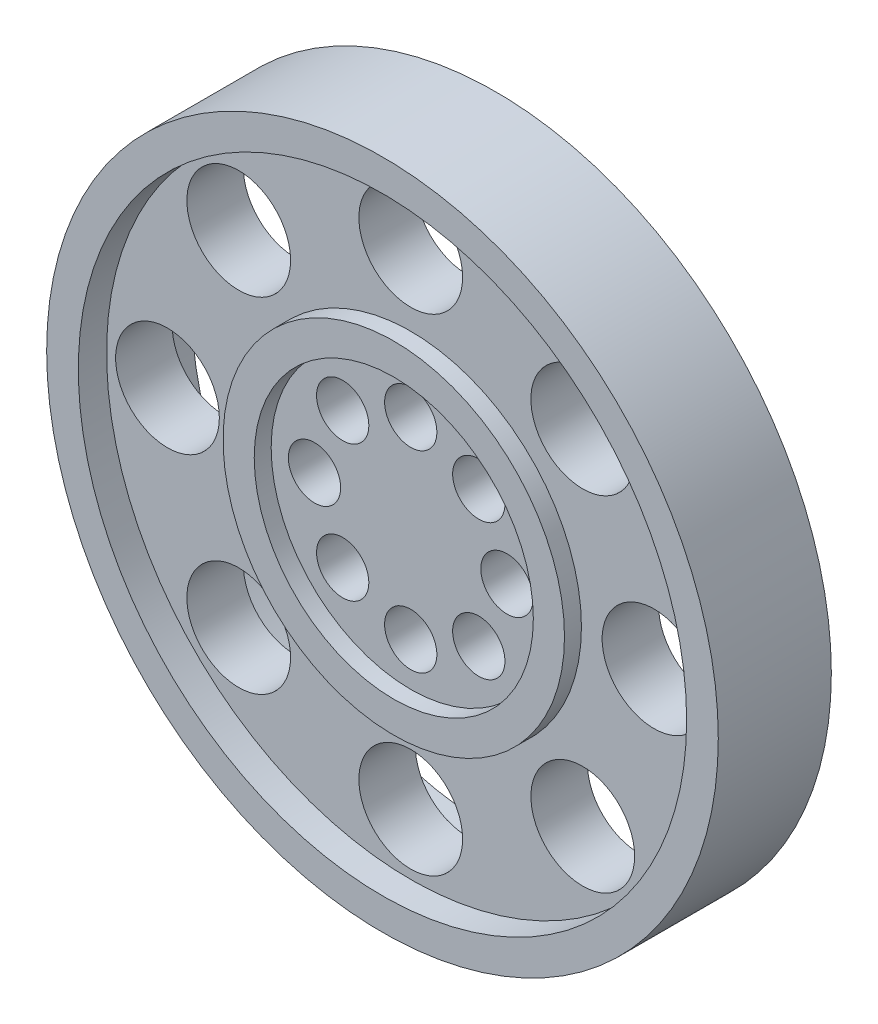
ISO-10303-21;
HEADER;
FILE_DESCRIPTION(('STEP AP214'),'2;1');
FILE_NAME('part.step','',(''),(''),'','','');
FILE_SCHEMA(('AUTOMOTIVE_DESIGN { 1 0 10303 214 1 1 1 1 }'));
ENDSEC;
DATA;
#1=APPLICATION_CONTEXT('core data for automotive mechanical design processes');
#2=APPLICATION_PROTOCOL_DEFINITION('international standard','automotive_design',2000,#1);
#3=PRODUCT_CONTEXT('',#1,'mechanical');
#4=PRODUCT('Part','Part','',(#3));
#5=PRODUCT_RELATED_PRODUCT_CATEGORY('part','',(#4));
#6=PRODUCT_DEFINITION_FORMATION('','',#4);
#7=PRODUCT_DEFINITION_CONTEXT('part definition',#1,'design');
#8=PRODUCT_DEFINITION('design','',#6,#7);
#9=PRODUCT_DEFINITION_SHAPE('','',#8);
#10=(LENGTH_UNIT() NAMED_UNIT(*) SI_UNIT(.MILLI.,.METRE.));
#11=(NAMED_UNIT(*) PLANE_ANGLE_UNIT() SI_UNIT($,.RADIAN.));
#12=(NAMED_UNIT(*) SI_UNIT($,.STERADIAN.) SOLID_ANGLE_UNIT());
#13=UNCERTAINTY_MEASURE_WITH_UNIT(LENGTH_MEASURE(1.E-05),#10,'distance_accuracy_value','');
#14=(GEOMETRIC_REPRESENTATION_CONTEXT(3) GLOBAL_UNCERTAINTY_ASSIGNED_CONTEXT((#13)) GLOBAL_UNIT_ASSIGNED_CONTEXT((#10,
#11,#12)) REPRESENTATION_CONTEXT('',''));
#15=CARTESIAN_POINT('',(0.,0.,0.));
#16=DIRECTION('',(0.,0.,1.));
#17=DIRECTION('',(1.,0.,0.));
#18=AXIS2_PLACEMENT_3D('',#15,#16,#17);
#19=CARTESIAN_POINT('',(0.,0.,8.));
#20=DIRECTION('',(0.,0.,-1.));
#21=DIRECTION('',(-1.,0.,0.));
#22=AXIS2_PLACEMENT_3D('',#19,#20,#21);
#23=CYLINDRICAL_SURFACE('',#22,24.69);
#24=CARTESIAN_POINT('',(0.,0.,-8.));
#25=DIRECTION('',(0.,0.,1.));
#26=DIRECTION('',(1.,0.,0.));
#27=AXIS2_PLACEMENT_3D('',#24,#25,#26);
#28=CIRCLE('',#27,24.69);
#29=CARTESIAN_POINT('',(24.69,0.,-8.));
#30=VERTEX_POINT('',#29);
#31=EDGE_CURVE('E129',#30,#30,#28,.T.);
#32=ORIENTED_EDGE('',*,*,#31,.F.);
#33=EDGE_LOOP('',(#32));
#34=FACE_BOUND('',#33,.T.);
#35=CARTESIAN_POINT('',(0.,0.,-5.));
#36=DIRECTION('',(0.,0.,1.));
#37=DIRECTION('',(1.,0.,0.));
#38=AXIS2_PLACEMENT_3D('',#35,#36,#37);
#39=CIRCLE('',#38,24.69);
#40=CARTESIAN_POINT('',(24.69,0.,-5.));
#41=VERTEX_POINT('',#40);
#42=EDGE_CURVE('E126',#41,#41,#39,.T.);
#43=ORIENTED_EDGE('',*,*,#42,.T.);
#44=EDGE_LOOP('',(#43));
#45=FACE_BOUND('',#44,.T.);
#46=ADVANCED_FACE('F39',(#34,#45),#23,.F.);
#47=CARTESIAN_POINT('',(0.,0.,10.));
#48=DIRECTION('',(0.,0.,-1.));
#49=DIRECTION('',(-1.,0.,0.));
#50=AXIS2_PLACEMENT_3D('',#47,#48,#49);
#51=CYLINDRICAL_SURFACE('',#50,53.81);
#52=CARTESIAN_POINT('',(0.,0.,-10.));
#53=DIRECTION('',(0.,0.,1.));
#54=DIRECTION('',(1.,0.,0.));
#55=AXIS2_PLACEMENT_3D('',#52,#53,#54);
#56=CIRCLE('',#55,53.81);
#57=CARTESIAN_POINT('',(53.81,0.,-10.));
#58=VERTEX_POINT('',#57);
#59=EDGE_CURVE('E152',#58,#58,#56,.T.);
#60=ORIENTED_EDGE('',*,*,#59,.F.);
#61=EDGE_LOOP('',(#60));
#62=FACE_BOUND('',#61,.T.);
#63=CARTESIAN_POINT('',(0.,0.,-5.));
#64=DIRECTION('',(0.,0.,1.));
#65=DIRECTION('',(1.,0.,0.));
#66=AXIS2_PLACEMENT_3D('',#63,#64,#65);
#67=CIRCLE('',#66,53.81);
#68=CARTESIAN_POINT('',(53.81,0.,-5.));
#69=VERTEX_POINT('',#68);
#70=EDGE_CURVE('E149',#69,#69,#67,.T.);
#71=ORIENTED_EDGE('',*,*,#70,.T.);
#72=EDGE_LOOP('',(#71));
#73=FACE_BOUND('',#72,.T.);
#74=ADVANCED_FACE('F185',(#62,#73),#51,.F.);
#75=CARTESIAN_POINT('',(0.,0.,5.));
#76=DIRECTION('',(0.,0.,1.));
#77=DIRECTION('',(1.,0.,0.));
#78=AXIS2_PLACEMENT_3D('',#75,#76,#77);
#79=CIRCLE('',#78,53.81);
#80=CARTESIAN_POINT('',(53.81,0.,5.));
#81=VERTEX_POINT('',#80);
#82=EDGE_CURVE('E47',#81,#81,#79,.T.);
#83=ORIENTED_EDGE('',*,*,#82,.F.);
#84=EDGE_LOOP('',(#83));
#85=FACE_BOUND('',#84,.T.);
#86=CARTESIAN_POINT('',(0.,0.,10.));
#87=DIRECTION('',(0.,0.,1.));
#88=DIRECTION('',(1.,0.,0.));
#89=AXIS2_PLACEMENT_3D('',#86,#87,#88);
#90=CIRCLE('',#89,53.81);
#91=CARTESIAN_POINT('',(53.81,0.,10.));
#92=VERTEX_POINT('',#91);
#93=EDGE_CURVE('E157',#92,#92,#90,.T.);
#94=ORIENTED_EDGE('',*,*,#93,.T.);
#95=EDGE_LOOP('',(#94));
#96=FACE_BOUND('',#95,.T.);
#97=ADVANCED_FACE('F41',(#85,#96),#51,.F.);
#98=CARTESIAN_POINT('',(0.,0.,10.));
#99=DIRECTION('',(0.,0.,-1.));
#100=DIRECTION('',(-1.,0.,0.));
#101=AXIS2_PLACEMENT_3D('',#98,#99,#100);
#102=CYLINDRICAL_SURFACE('',#101,59.41);
#103=CARTESIAN_POINT('',(0.,0.,10.));
#104=DIRECTION('',(0.,0.,1.));
#105=DIRECTION('',(1.,0.,0.));
#106=AXIS2_PLACEMENT_3D('',#103,#104,#105);
#107=CIRCLE('',#106,59.41);
#108=CARTESIAN_POINT('',(59.41,0.,10.));
#109=VERTEX_POINT('',#108);
#110=EDGE_CURVE('E52',#109,#109,#107,.T.);
#111=ORIENTED_EDGE('',*,*,#110,.F.);
#112=EDGE_LOOP('',(#111));
#113=FACE_BOUND('',#112,.T.);
#114=CARTESIAN_POINT('',(0.,0.,-10.));
#115=DIRECTION('',(0.,0.,1.));
#116=DIRECTION('',(1.,0.,0.));
#117=AXIS2_PLACEMENT_3D('',#114,#115,#116);
#118=CIRCLE('',#117,59.41);
#119=CARTESIAN_POINT('',(59.41,0.,-10.));
#120=VERTEX_POINT('',#119);
#121=EDGE_CURVE('E160',#120,#120,#118,.T.);
#122=ORIENTED_EDGE('',*,*,#121,.T.);
#123=EDGE_LOOP('',(#122));
#124=FACE_BOUND('',#123,.T.);
#125=ADVANCED_FACE('F167',(#113,#124),#102,.T.);
#126=CARTESIAN_POINT('',(0.,0.,10.));
#127=DIRECTION('',(0.,0.,1.));
#128=DIRECTION('',(1.,0.,0.));
#129=AXIS2_PLACEMENT_3D('',#126,#127,#128);
#130=PLANE('',#129);
#131=ORIENTED_EDGE('',*,*,#93,.F.);
#132=EDGE_LOOP('',(#131));
#133=FACE_BOUND('',#132,.T.);
#134=ORIENTED_EDGE('',*,*,#110,.T.);
#135=EDGE_LOOP('',(#134));
#136=FACE_BOUND('',#135,.T.);
#137=ADVANCED_FACE('F172',(#133,#136),#130,.T.);
#138=CARTESIAN_POINT('',(0.,0.,-10.));
#139=DIRECTION('',(0.,0.,1.));
#140=DIRECTION('',(1.,0.,0.));
#141=AXIS2_PLACEMENT_3D('',#138,#139,#140);
#142=PLANE('',#141);
#143=ORIENTED_EDGE('',*,*,#59,.T.);
#144=EDGE_LOOP('',(#143));
#145=FACE_BOUND('',#144,.T.);
#146=ORIENTED_EDGE('',*,*,#121,.F.);
#147=EDGE_LOOP('',(#146));
#148=FACE_BOUND('',#147,.T.);
#149=ADVANCED_FACE('F169',(#145,#148),#142,.F.);
#150=CARTESIAN_POINT('',(0.,43.035,5.));
#151=DIRECTION('',(0.,0.,-1.));
#152=DIRECTION('',(-1.,0.,0.));
#153=AXIS2_PLACEMENT_3D('',#150,#151,#152);
#154=CYLINDRICAL_SURFACE('',#153,9.175);
#155=CARTESIAN_POINT('',(0.,43.035,5.));
#156=DIRECTION('',(0.,0.,1.));
#157=DIRECTION('',(1.,0.,0.));
#158=AXIS2_PLACEMENT_3D('',#155,#156,#157);
#159=CIRCLE('',#158,9.175);
#160=CARTESIAN_POINT('',(9.175,43.035,5.));
#161=VERTEX_POINT('',#160);
#162=EDGE_CURVE('E145',#161,#161,#159,.T.);
#163=ORIENTED_EDGE('',*,*,#162,.T.);
#164=EDGE_LOOP('',(#163));
#165=FACE_BOUND('',#164,.T.);
#166=CARTESIAN_POINT('',(0.,43.035,-5.));
#167=DIRECTION('',(0.,0.,1.));
#168=DIRECTION('',(1.,0.,0.));
#169=AXIS2_PLACEMENT_3D('',#166,#167,#168);
#170=CIRCLE('',#169,9.175);
#171=CARTESIAN_POINT('',(9.175,43.035,-5.));
#172=VERTEX_POINT('',#171);
#173=EDGE_CURVE('E144',#172,#172,#170,.T.);
#174=ORIENTED_EDGE('',*,*,#173,.F.);
#175=EDGE_LOOP('',(#174));
#176=FACE_BOUND('',#175,.T.);
#177=ADVANCED_FACE('F171',(#165,#176),#154,.F.);
#178=CARTESIAN_POINT('',(0.,0.,5.));
#179=DIRECTION('',(0.,0.,1.));
#180=DIRECTION('',(1.,0.,0.));
#181=AXIS2_PLACEMENT_3D('',#178,#179,#180);
#182=PLANE('',#181);
#183=CARTESIAN_POINT('',(-30.4303403283629,-30.4303403283632,5.));
#184=DIRECTION('',(0.,0.,1.));
#185=DIRECTION('',(1.,0.,0.));
#186=AXIS2_PLACEMENT_3D('',#183,#184,#185);
#187=CIRCLE('',#186,9.175);
#188=CARTESIAN_POINT('',(-21.2553403283629,-30.4303403283632,5.));
#189=VERTEX_POINT('',#188);
#190=EDGE_CURVE('E60',#189,#189,#187,.T.);
#191=ORIENTED_EDGE('',*,*,#190,.F.);
#192=EDGE_LOOP('',(#191));
#193=FACE_BOUND('',#192,.T.);
#194=CARTESIAN_POINT('',(0.,-43.035,5.));
#195=DIRECTION('',(0.,0.,1.));
#196=DIRECTION('',(1.,0.,0.));
#197=AXIS2_PLACEMENT_3D('',#194,#195,#196);
#198=CIRCLE('',#197,9.175);
#199=CARTESIAN_POINT('',(9.175,-43.035,5.));
#200=VERTEX_POINT('',#199);
#201=EDGE_CURVE('E110',#200,#200,#198,.T.);
#202=ORIENTED_EDGE('',*,*,#201,.F.);
#203=EDGE_LOOP('',(#202));
#204=FACE_BOUND('',#203,.T.);
#205=CARTESIAN_POINT('',(-30.4303403283631,30.430340328363,5.));
#206=DIRECTION('',(0.,0.,1.));
#207=DIRECTION('',(1.,0.,0.));
#208=AXIS2_PLACEMENT_3D('',#205,#206,#207);
#209=CIRCLE('',#208,9.175);
#210=CARTESIAN_POINT('',(-21.2553403283631,30.430340328363,5.));
#211=VERTEX_POINT('',#210);
#212=EDGE_CURVE('E107',#211,#211,#209,.T.);
#213=ORIENTED_EDGE('',*,*,#212,.F.);
#214=EDGE_LOOP('',(#213));
#215=FACE_BOUND('',#214,.T.);
#216=CARTESIAN_POINT('',(-43.035,-1.49379452430569E-13,5.));
#217=DIRECTION('',(0.,0.,1.));
#218=DIRECTION('',(1.,0.,0.));
#219=AXIS2_PLACEMENT_3D('',#216,#217,#218);
#220=CIRCLE('',#219,9.175);
#221=CARTESIAN_POINT('',(-33.86,-1.49379452430569E-13,5.));
#222=VERTEX_POINT('',#221);
#223=EDGE_CURVE('E104',#222,#222,#220,.T.);
#224=ORIENTED_EDGE('',*,*,#223,.F.);
#225=EDGE_LOOP('',(#224));
#226=FACE_BOUND('',#225,.T.);
#227=CARTESIAN_POINT('',(43.035,4.49891251264798E-13,5.));
#228=DIRECTION('',(0.,0.,1.));
#229=DIRECTION('',(1.,0.,0.));
#230=AXIS2_PLACEMENT_3D('',#227,#228,#229);
#231=CIRCLE('',#230,9.175);
#232=CARTESIAN_POINT('',(52.21,4.49891251264798E-13,5.));
#233=VERTEX_POINT('',#232);
#234=EDGE_CURVE('E100',#233,#233,#231,.T.);
#235=ORIENTED_EDGE('',*,*,#234,.F.);
#236=EDGE_LOOP('',(#235));
#237=FACE_BOUND('',#236,.T.);
#238=CARTESIAN_POINT('',(30.4303403283633,-30.4303403283628,5.));
#239=DIRECTION('',(0.,0.,1.));
#240=DIRECTION('',(1.,0.,0.));
#241=AXIS2_PLACEMENT_3D('',#238,#239,#240);
#242=CIRCLE('',#241,9.175);
#243=CARTESIAN_POINT('',(39.6053403283633,-30.4303403283628,5.));
#244=VERTEX_POINT('',#243);
#245=EDGE_CURVE('E96',#244,#244,#242,.T.);
#246=ORIENTED_EDGE('',*,*,#245,.F.);
#247=EDGE_LOOP('',(#246));
#248=FACE_BOUND('',#247,.T.);
#249=CARTESIAN_POINT('',(30.4303403283627,30.4303403283634,5.));
#250=DIRECTION('',(0.,0.,1.));
#251=DIRECTION('',(1.,0.,0.));
#252=AXIS2_PLACEMENT_3D('',#249,#250,#251);
#253=CIRCLE('',#252,9.175);
#254=CARTESIAN_POINT('',(39.6053403283627,30.4303403283634,5.));
#255=VERTEX_POINT('',#254);
#256=EDGE_CURVE('E92',#255,#255,#253,.T.);
#257=ORIENTED_EDGE('',*,*,#256,.F.);
#258=EDGE_LOOP('',(#257));
#259=FACE_BOUND('',#258,.T.);
#260=ORIENTED_EDGE('',*,*,#162,.F.);
#261=EDGE_LOOP('',(#260));
#262=FACE_BOUND('',#261,.T.);
#263=CARTESIAN_POINT('',(0.,0.,5.));
#264=DIRECTION('',(0.,0.,1.));
#265=DIRECTION('',(1.,0.,0.));
#266=AXIS2_PLACEMENT_3D('',#263,#264,#265);
#267=CIRCLE('',#266,30.2);
#268=CARTESIAN_POINT('',(30.2,0.,5.));
#269=VERTEX_POINT('',#268);
#270=EDGE_CURVE('E148',#269,#269,#267,.T.);
#271=ORIENTED_EDGE('',*,*,#270,.F.);
#272=EDGE_LOOP('',(#271));
#273=FACE_BOUND('',#272,.T.);
#274=ORIENTED_EDGE('',*,*,#82,.T.);
#275=EDGE_LOOP('',(#274));
#276=FACE_BOUND('',#275,.T.);
#277=ADVANCED_FACE('F179',(#193,#204,#215,#226,#237,#248,#259,#262,#273,#276),#182,.T.);
#278=CARTESIAN_POINT('',(0.,0.,-5.));
#279=DIRECTION('',(0.,0.,1.));
#280=DIRECTION('',(1.,0.,0.));
#281=AXIS2_PLACEMENT_3D('',#278,#279,#280);
#282=PLANE('',#281);
#283=CARTESIAN_POINT('',(-30.4303403283629,-30.4303403283632,-5.));
#284=DIRECTION('',(0.,0.,1.));
#285=DIRECTION('',(1.,0.,0.));
#286=AXIS2_PLACEMENT_3D('',#283,#284,#285);
#287=CIRCLE('',#286,9.175);
#288=CARTESIAN_POINT('',(-21.2553403283629,-30.4303403283632,-5.));
#289=VERTEX_POINT('',#288);
#290=EDGE_CURVE('E43',#289,#289,#287,.T.);
#291=ORIENTED_EDGE('',*,*,#290,.T.);
#292=EDGE_LOOP('',(#291));
#293=FACE_BOUND('',#292,.T.);
#294=CARTESIAN_POINT('',(0.,-43.035,-5.));
#295=DIRECTION('',(0.,0.,1.));
#296=DIRECTION('',(1.,0.,0.));
#297=AXIS2_PLACEMENT_3D('',#294,#295,#296);
#298=CIRCLE('',#297,9.175);
#299=CARTESIAN_POINT('',(9.175,-43.035,-5.));
#300=VERTEX_POINT('',#299);
#301=EDGE_CURVE('E108',#300,#300,#298,.T.);
#302=ORIENTED_EDGE('',*,*,#301,.T.);
#303=EDGE_LOOP('',(#302));
#304=FACE_BOUND('',#303,.T.);
#305=CARTESIAN_POINT('',(-30.4303403283631,30.430340328363,-5.));
#306=DIRECTION('',(0.,0.,1.));
#307=DIRECTION('',(1.,0.,0.));
#308=AXIS2_PLACEMENT_3D('',#305,#306,#307);
#309=CIRCLE('',#308,9.175);
#310=CARTESIAN_POINT('',(-21.2553403283631,30.430340328363,-5.));
#311=VERTEX_POINT('',#310);
#312=EDGE_CURVE('E105',#311,#311,#309,.T.);
#313=ORIENTED_EDGE('',*,*,#312,.T.);
#314=EDGE_LOOP('',(#313));
#315=FACE_BOUND('',#314,.T.);
#316=CARTESIAN_POINT('',(-43.035,-1.49379452430569E-13,-5.));
#317=DIRECTION('',(0.,0.,1.));
#318=DIRECTION('',(1.,0.,0.));
#319=AXIS2_PLACEMENT_3D('',#316,#317,#318);
#320=CIRCLE('',#319,9.175);
#321=CARTESIAN_POINT('',(-33.86,-1.49379452430569E-13,-5.));
#322=VERTEX_POINT('',#321);
#323=EDGE_CURVE('E101',#322,#322,#320,.T.);
#324=ORIENTED_EDGE('',*,*,#323,.T.);
#325=EDGE_LOOP('',(#324));
#326=FACE_BOUND('',#325,.T.);
#327=CARTESIAN_POINT('',(43.035,4.49891251264798E-13,-5.));
#328=DIRECTION('',(0.,0.,1.));
#329=DIRECTION('',(1.,0.,0.));
#330=AXIS2_PLACEMENT_3D('',#327,#328,#329);
#331=CIRCLE('',#330,9.175);
#332=CARTESIAN_POINT('',(52.21,4.49891251264798E-13,-5.));
#333=VERTEX_POINT('',#332);
#334=EDGE_CURVE('E97',#333,#333,#331,.T.);
#335=ORIENTED_EDGE('',*,*,#334,.T.);
#336=EDGE_LOOP('',(#335));
#337=FACE_BOUND('',#336,.T.);
#338=CARTESIAN_POINT('',(30.4303403283633,-30.4303403283628,-5.));
#339=DIRECTION('',(0.,0.,1.));
#340=DIRECTION('',(1.,0.,0.));
#341=AXIS2_PLACEMENT_3D('',#338,#339,#340);
#342=CIRCLE('',#341,9.175);
#343=CARTESIAN_POINT('',(39.6053403283633,-30.4303403283628,-5.));
#344=VERTEX_POINT('',#343);
#345=EDGE_CURVE('E93',#344,#344,#342,.T.);
#346=ORIENTED_EDGE('',*,*,#345,.T.);
#347=EDGE_LOOP('',(#346));
#348=FACE_BOUND('',#347,.T.);
#349=CARTESIAN_POINT('',(30.4303403283627,30.4303403283634,-5.));
#350=DIRECTION('',(0.,0.,1.));
#351=DIRECTION('',(1.,0.,0.));
#352=AXIS2_PLACEMENT_3D('',#349,#350,#351);
#353=CIRCLE('',#352,9.175);
#354=CARTESIAN_POINT('',(39.6053403283627,30.4303403283634,-5.));
#355=VERTEX_POINT('',#354);
#356=EDGE_CURVE('E89',#355,#355,#353,.T.);
#357=ORIENTED_EDGE('',*,*,#356,.T.);
#358=EDGE_LOOP('',(#357));
#359=FACE_BOUND('',#358,.T.);
#360=ORIENTED_EDGE('',*,*,#173,.T.);
#361=EDGE_LOOP('',(#360));
#362=FACE_BOUND('',#361,.T.);
#363=CARTESIAN_POINT('',(0.,0.,-5.));
#364=DIRECTION('',(0.,0.,1.));
#365=DIRECTION('',(1.,0.,0.));
#366=AXIS2_PLACEMENT_3D('',#363,#364,#365);
#367=CIRCLE('',#366,30.2);
#368=CARTESIAN_POINT('',(30.2,0.,-5.));
#369=VERTEX_POINT('',#368);
#370=EDGE_CURVE('E137',#369,#369,#367,.F.);
#371=ORIENTED_EDGE('',*,*,#370,.F.);
#372=EDGE_LOOP('',(#371));
#373=FACE_BOUND('',#372,.T.);
#374=ORIENTED_EDGE('',*,*,#70,.F.);
#375=EDGE_LOOP('',(#374));
#376=FACE_BOUND('',#375,.T.);
#377=ADVANCED_FACE('F207',(#293,#304,#315,#326,#337,#348,#359,#362,#373,#376),#282,.F.);
#378=CARTESIAN_POINT('',(0.,0.,8.));
#379=DIRECTION('',(0.,0.,-1.));
#380=DIRECTION('',(-1.,0.,0.));
#381=AXIS2_PLACEMENT_3D('',#378,#379,#380);
#382=CYLINDRICAL_SURFACE('',#381,30.2);
#383=CARTESIAN_POINT('',(0.,0.,-8.));
#384=DIRECTION('',(0.,0.,1.));
#385=DIRECTION('',(1.,0.,0.));
#386=AXIS2_PLACEMENT_3D('',#383,#384,#385);
#387=CIRCLE('',#386,30.2);
#388=CARTESIAN_POINT('',(30.2,0.,-8.));
#389=VERTEX_POINT('',#388);
#390=EDGE_CURVE('E134',#389,#389,#387,.T.);
#391=ORIENTED_EDGE('',*,*,#390,.T.);
#392=EDGE_LOOP('',(#391));
#393=FACE_BOUND('',#392,.T.);
#394=ORIENTED_EDGE('',*,*,#370,.T.);
#395=EDGE_LOOP('',(#394));
#396=FACE_BOUND('',#395,.T.);
#397=ADVANCED_FACE('F199',(#393,#396),#382,.T.);
#398=CARTESIAN_POINT('',(0.,0.,5.));
#399=DIRECTION('',(0.,0.,1.));
#400=DIRECTION('',(1.,0.,0.));
#401=AXIS2_PLACEMENT_3D('',#398,#399,#400);
#402=CIRCLE('',#401,24.69);
#403=CARTESIAN_POINT('',(24.69,0.,5.));
#404=VERTEX_POINT('',#403);
#405=EDGE_CURVE('E11',#404,#404,#402,.T.);
#406=ORIENTED_EDGE('',*,*,#405,.F.);
#407=EDGE_LOOP('',(#406));
#408=FACE_BOUND('',#407,.T.);
#409=CARTESIAN_POINT('',(0.,0.,8.));
#410=DIRECTION('',(0.,0.,1.));
#411=DIRECTION('',(1.,0.,0.));
#412=AXIS2_PLACEMENT_3D('',#409,#410,#411);
#413=CIRCLE('',#412,24.69);
#414=CARTESIAN_POINT('',(24.69,0.,8.));
#415=VERTEX_POINT('',#414);
#416=EDGE_CURVE('E130',#415,#415,#413,.T.);
#417=ORIENTED_EDGE('',*,*,#416,.T.);
#418=EDGE_LOOP('',(#417));
#419=FACE_BOUND('',#418,.T.);
#420=ADVANCED_FACE('F188',(#408,#419),#23,.F.);
#421=ORIENTED_EDGE('',*,*,#270,.T.);
#422=EDGE_LOOP('',(#421));
#423=FACE_BOUND('',#422,.T.);
#424=CARTESIAN_POINT('',(0.,0.,8.));
#425=DIRECTION('',(0.,0.,1.));
#426=DIRECTION('',(1.,0.,0.));
#427=AXIS2_PLACEMENT_3D('',#424,#425,#426);
#428=CIRCLE('',#427,30.2);
#429=CARTESIAN_POINT('',(30.2,0.,8.));
#430=VERTEX_POINT('',#429);
#431=EDGE_CURVE('E133',#430,#430,#428,.T.);
#432=ORIENTED_EDGE('',*,*,#431,.F.);
#433=EDGE_LOOP('',(#432));
#434=FACE_BOUND('',#433,.T.);
#435=ADVANCED_FACE('F198',(#423,#434),#382,.T.);
#436=CARTESIAN_POINT('',(0.,0.,8.));
#437=DIRECTION('',(0.,0.,1.));
#438=DIRECTION('',(1.,0.,0.));
#439=AXIS2_PLACEMENT_3D('',#436,#437,#438);
#440=PLANE('',#439);
#441=ORIENTED_EDGE('',*,*,#416,.F.);
#442=EDGE_LOOP('',(#441));
#443=FACE_BOUND('',#442,.T.);
#444=ORIENTED_EDGE('',*,*,#431,.T.);
#445=EDGE_LOOP('',(#444));
#446=FACE_BOUND('',#445,.T.);
#447=ADVANCED_FACE('F205',(#443,#446),#440,.T.);
#448=CARTESIAN_POINT('',(0.,0.,-8.));
#449=DIRECTION('',(0.,0.,1.));
#450=DIRECTION('',(1.,0.,0.));
#451=AXIS2_PLACEMENT_3D('',#448,#449,#450);
#452=PLANE('',#451);
#453=ORIENTED_EDGE('',*,*,#31,.T.);
#454=EDGE_LOOP('',(#453));
#455=FACE_BOUND('',#454,.T.);
#456=ORIENTED_EDGE('',*,*,#390,.F.);
#457=EDGE_LOOP('',(#456));
#458=FACE_BOUND('',#457,.T.);
#459=ADVANCED_FACE('F214',(#455,#458),#452,.F.);
#460=CARTESIAN_POINT('',(0.,0.,-5.));
#461=DIRECTION('',(0.,0.,1.));
#462=DIRECTION('',(1.,0.,0.));
#463=AXIS2_PLACEMENT_3D('',#460,#461,#462);
#464=PLANE('',#463);
#465=CARTESIAN_POINT('',(0.,-17.0240575008076,-5.));
#466=DIRECTION('',(0.,0.,1.));
#467=DIRECTION('',(1.,0.,0.));
#468=AXIS2_PLACEMENT_3D('',#465,#466,#467);
#469=CIRCLE('',#468,4.625);
#470=CARTESIAN_POINT('',(4.625,-17.0240575008076,-5.));
#471=VERTEX_POINT('',#470);
#472=EDGE_CURVE('E88',#471,#471,#469,.T.);
#473=ORIENTED_EDGE('',*,*,#472,.T.);
#474=EDGE_LOOP('',(#473));
#475=FACE_BOUND('',#474,.T.);
#476=CARTESIAN_POINT('',(12.0378265021308,-12.0378265021306,-5.));
#477=DIRECTION('',(0.,0.,1.));
#478=DIRECTION('',(1.,0.,0.));
#479=AXIS2_PLACEMENT_3D('',#476,#477,#478);
#480=CIRCLE('',#479,4.625);
#481=CARTESIAN_POINT('',(16.6628265021308,-12.0378265021306,-5.));
#482=VERTEX_POINT('',#481);
#483=EDGE_CURVE('E84',#482,#482,#480,.T.);
#484=ORIENTED_EDGE('',*,*,#483,.T.);
#485=EDGE_LOOP('',(#484));
#486=FACE_BOUND('',#485,.T.);
#487=CARTESIAN_POINT('',(-17.0240575008076,0.,-5.));
#488=DIRECTION('',(0.,0.,1.));
#489=DIRECTION('',(1.,0.,0.));
#490=AXIS2_PLACEMENT_3D('',#487,#488,#489);
#491=CIRCLE('',#490,4.625);
#492=CARTESIAN_POINT('',(-12.3990575008076,0.,-5.));
#493=VERTEX_POINT('',#492);
#494=EDGE_CURVE('E80',#493,#493,#491,.T.);
#495=ORIENTED_EDGE('',*,*,#494,.T.);
#496=EDGE_LOOP('',(#495));
#497=FACE_BOUND('',#496,.T.);
#498=CARTESIAN_POINT('',(-12.0378265021307,-12.0378265021308,-5.));
#499=DIRECTION('',(0.,0.,1.));
#500=DIRECTION('',(1.,0.,0.));
#501=AXIS2_PLACEMENT_3D('',#498,#499,#500);
#502=CIRCLE('',#501,4.625);
#503=CARTESIAN_POINT('',(-7.41282650213068,-12.0378265021308,-5.));
#504=VERTEX_POINT('',#503);
#505=EDGE_CURVE('E76',#504,#504,#502,.T.);
#506=ORIENTED_EDGE('',*,*,#505,.T.);
#507=EDGE_LOOP('',(#506));
#508=FACE_BOUND('',#507,.T.);
#509=CARTESIAN_POINT('',(12.0378265021306,12.0378265021309,-5.));
#510=DIRECTION('',(0.,0.,1.));
#511=DIRECTION('',(1.,0.,0.));
#512=AXIS2_PLACEMENT_3D('',#509,#510,#511);
#513=CIRCLE('',#512,4.625);
#514=CARTESIAN_POINT('',(16.6628265021306,12.0378265021309,-5.));
#515=VERTEX_POINT('',#514);
#516=EDGE_CURVE('E72',#515,#515,#513,.T.);
#517=ORIENTED_EDGE('',*,*,#516,.T.);
#518=EDGE_LOOP('',(#517));
#519=FACE_BOUND('',#518,.T.);
#520=CARTESIAN_POINT('',(17.0240575008076,1.78317537226386E-13,-5.));
#521=DIRECTION('',(0.,0.,1.));
#522=DIRECTION('',(1.,0.,0.));
#523=AXIS2_PLACEMENT_3D('',#520,#521,#522);
#524=CIRCLE('',#523,4.625);
#525=CARTESIAN_POINT('',(21.6490575008076,1.78317537226386E-13,-5.));
#526=VERTEX_POINT('',#525);
#527=EDGE_CURVE('E68',#526,#526,#524,.T.);
#528=ORIENTED_EDGE('',*,*,#527,.T.);
#529=EDGE_LOOP('',(#528));
#530=FACE_BOUND('',#529,.T.);
#531=CARTESIAN_POINT('',(-12.0378265021308,12.0378265021307,-5.));
#532=DIRECTION('',(0.,0.,1.));
#533=DIRECTION('',(1.,0.,0.));
#534=AXIS2_PLACEMENT_3D('',#531,#532,#533);
#535=CIRCLE('',#534,4.625);
#536=CARTESIAN_POINT('',(-7.41282650213077,12.0378265021307,-5.));
#537=VERTEX_POINT('',#536);
#538=EDGE_CURVE('E64',#537,#537,#535,.T.);
#539=ORIENTED_EDGE('',*,*,#538,.T.);
#540=EDGE_LOOP('',(#539));
#541=FACE_BOUND('',#540,.T.);
#542=CARTESIAN_POINT('',(0.,17.0240575008076,-5.));
#543=DIRECTION('',(0.,0.,1.));
#544=DIRECTION('',(1.,0.,0.));
#545=AXIS2_PLACEMENT_3D('',#542,#543,#544);
#546=CIRCLE('',#545,4.625);
#547=CARTESIAN_POINT('',(4.625,17.0240575008076,-5.));
#548=VERTEX_POINT('',#547);
#549=EDGE_CURVE('E59',#548,#548,#546,.T.);
#550=ORIENTED_EDGE('',*,*,#549,.T.);
#551=EDGE_LOOP('',(#550));
#552=FACE_BOUND('',#551,.T.);
#553=ORIENTED_EDGE('',*,*,#42,.F.);
#554=EDGE_LOOP('',(#553));
#555=FACE_BOUND('',#554,.T.);
#556=ADVANCED_FACE('F221',(#475,#486,#497,#508,#519,#530,#541,#552,#555),#464,.F.);
#557=CARTESIAN_POINT('',(0.,0.,5.));
#558=DIRECTION('',(0.,0.,1.));
#559=DIRECTION('',(1.,0.,0.));
#560=AXIS2_PLACEMENT_3D('',#557,#558,#559);
#561=PLANE('',#560);
#562=CARTESIAN_POINT('',(0.,-17.0240575008076,5.));
#563=DIRECTION('',(0.,0.,1.));
#564=DIRECTION('',(1.,0.,0.));
#565=AXIS2_PLACEMENT_3D('',#562,#563,#564);
#566=CIRCLE('',#565,4.625);
#567=CARTESIAN_POINT('',(4.625,-17.0240575008076,5.));
#568=VERTEX_POINT('',#567);
#569=EDGE_CURVE('E85',#568,#568,#566,.T.);
#570=ORIENTED_EDGE('',*,*,#569,.F.);
#571=EDGE_LOOP('',(#570));
#572=FACE_BOUND('',#571,.T.);
#573=CARTESIAN_POINT('',(12.0378265021308,-12.0378265021306,5.));
#574=DIRECTION('',(0.,0.,1.));
#575=DIRECTION('',(1.,0.,0.));
#576=AXIS2_PLACEMENT_3D('',#573,#574,#575);
#577=CIRCLE('',#576,4.625);
#578=CARTESIAN_POINT('',(16.6628265021308,-12.0378265021306,5.));
#579=VERTEX_POINT('',#578);
#580=EDGE_CURVE('E81',#579,#579,#577,.T.);
#581=ORIENTED_EDGE('',*,*,#580,.F.);
#582=EDGE_LOOP('',(#581));
#583=FACE_BOUND('',#582,.T.);
#584=CARTESIAN_POINT('',(-17.0240575008076,0.,5.));
#585=DIRECTION('',(0.,0.,1.));
#586=DIRECTION('',(1.,0.,0.));
#587=AXIS2_PLACEMENT_3D('',#584,#585,#586);
#588=CIRCLE('',#587,4.625);
#589=CARTESIAN_POINT('',(-12.3990575008076,0.,5.));
#590=VERTEX_POINT('',#589);
#591=EDGE_CURVE('E77',#590,#590,#588,.T.);
#592=ORIENTED_EDGE('',*,*,#591,.F.);
#593=EDGE_LOOP('',(#592));
#594=FACE_BOUND('',#593,.T.);
#595=CARTESIAN_POINT('',(-12.0378265021307,-12.0378265021308,5.));
#596=DIRECTION('',(0.,0.,1.));
#597=DIRECTION('',(1.,0.,0.));
#598=AXIS2_PLACEMENT_3D('',#595,#596,#597);
#599=CIRCLE('',#598,4.625);
#600=CARTESIAN_POINT('',(-7.41282650213068,-12.0378265021308,5.));
#601=VERTEX_POINT('',#600);
#602=EDGE_CURVE('E73',#601,#601,#599,.T.);
#603=ORIENTED_EDGE('',*,*,#602,.F.);
#604=EDGE_LOOP('',(#603));
#605=FACE_BOUND('',#604,.T.);
#606=CARTESIAN_POINT('',(12.0378265021306,12.0378265021309,5.));
#607=DIRECTION('',(0.,0.,1.));
#608=DIRECTION('',(1.,0.,0.));
#609=AXIS2_PLACEMENT_3D('',#606,#607,#608);
#610=CIRCLE('',#609,4.625);
#611=CARTESIAN_POINT('',(16.6628265021306,12.0378265021309,5.));
#612=VERTEX_POINT('',#611);
#613=EDGE_CURVE('E69',#612,#612,#610,.T.);
#614=ORIENTED_EDGE('',*,*,#613,.F.);
#615=EDGE_LOOP('',(#614));
#616=FACE_BOUND('',#615,.T.);
#617=CARTESIAN_POINT('',(17.0240575008076,1.78317537226386E-13,5.));
#618=DIRECTION('',(0.,0.,1.));
#619=DIRECTION('',(1.,0.,0.));
#620=AXIS2_PLACEMENT_3D('',#617,#618,#619);
#621=CIRCLE('',#620,4.625);
#622=CARTESIAN_POINT('',(21.6490575008076,1.78317537226386E-13,5.));
#623=VERTEX_POINT('',#622);
#624=EDGE_CURVE('E65',#623,#623,#621,.T.);
#625=ORIENTED_EDGE('',*,*,#624,.F.);
#626=EDGE_LOOP('',(#625));
#627=FACE_BOUND('',#626,.T.);
#628=CARTESIAN_POINT('',(-12.0378265021308,12.0378265021307,5.));
#629=DIRECTION('',(0.,0.,1.));
#630=DIRECTION('',(1.,0.,0.));
#631=AXIS2_PLACEMENT_3D('',#628,#629,#630);
#632=CIRCLE('',#631,4.625);
#633=CARTESIAN_POINT('',(-7.41282650213077,12.0378265021307,5.));
#634=VERTEX_POINT('',#633);
#635=EDGE_CURVE('E61',#634,#634,#632,.T.);
#636=ORIENTED_EDGE('',*,*,#635,.F.);
#637=EDGE_LOOP('',(#636));
#638=FACE_BOUND('',#637,.T.);
#639=CARTESIAN_POINT('',(0.,17.0240575008076,5.));
#640=DIRECTION('',(0.,0.,1.));
#641=DIRECTION('',(1.,0.,0.));
#642=AXIS2_PLACEMENT_3D('',#639,#640,#641);
#643=CIRCLE('',#642,4.625);
#644=CARTESIAN_POINT('',(4.625,17.0240575008076,5.));
#645=VERTEX_POINT('',#644);
#646=EDGE_CURVE('E56',#645,#645,#643,.T.);
#647=ORIENTED_EDGE('',*,*,#646,.F.);
#648=EDGE_LOOP('',(#647));
#649=FACE_BOUND('',#648,.T.);
#650=ORIENTED_EDGE('',*,*,#405,.T.);
#651=EDGE_LOOP('',(#650));
#652=FACE_BOUND('',#651,.T.);
#653=ADVANCED_FACE('F225',(#572,#583,#594,#605,#616,#627,#638,#649,#652),#561,.T.);
#654=CARTESIAN_POINT('',(0.,17.0240575008076,-10.));
#655=DIRECTION('',(0.,0.,1.));
#656=DIRECTION('',(1.,0.,0.));
#657=AXIS2_PLACEMENT_3D('',#654,#655,#656);
#658=CYLINDRICAL_SURFACE('',#657,4.625);
#659=ORIENTED_EDGE('',*,*,#646,.T.);
#660=EDGE_LOOP('',(#659));
#661=FACE_BOUND('',#660,.T.);
#662=ORIENTED_EDGE('',*,*,#549,.F.);
#663=EDGE_LOOP('',(#662));
#664=FACE_BOUND('',#663,.T.);
#665=ADVANCED_FACE('F228',(#661,#664),#658,.F.);
#666=CARTESIAN_POINT('',(-12.0378265021308,12.0378265021307,-10.));
#667=DIRECTION('',(0.,0.,1.));
#668=DIRECTION('',(1.,0.,0.));
#669=AXIS2_PLACEMENT_3D('',#666,#667,#668);
#670=CYLINDRICAL_SURFACE('',#669,4.625);
#671=ORIENTED_EDGE('',*,*,#635,.T.);
#672=EDGE_LOOP('',(#671));
#673=FACE_BOUND('',#672,.T.);
#674=ORIENTED_EDGE('',*,*,#538,.F.);
#675=EDGE_LOOP('',(#674));
#676=FACE_BOUND('',#675,.T.);
#677=ADVANCED_FACE('F235',(#673,#676),#670,.F.);
#678=CARTESIAN_POINT('',(17.0240575008076,1.78317537226386E-13,-10.));
#679=DIRECTION('',(0.,0.,1.));
#680=DIRECTION('',(1.,0.,0.));
#681=AXIS2_PLACEMENT_3D('',#678,#679,#680);
#682=CYLINDRICAL_SURFACE('',#681,4.625);
#683=ORIENTED_EDGE('',*,*,#624,.T.);
#684=EDGE_LOOP('',(#683));
#685=FACE_BOUND('',#684,.T.);
#686=ORIENTED_EDGE('',*,*,#527,.F.);
#687=EDGE_LOOP('',(#686));
#688=FACE_BOUND('',#687,.T.);
#689=ADVANCED_FACE('F239',(#685,#688),#682,.F.);
#690=CARTESIAN_POINT('',(12.0378265021306,12.0378265021309,-10.));
#691=DIRECTION('',(0.,0.,1.));
#692=DIRECTION('',(1.,0.,0.));
#693=AXIS2_PLACEMENT_3D('',#690,#691,#692);
#694=CYLINDRICAL_SURFACE('',#693,4.625);
#695=ORIENTED_EDGE('',*,*,#613,.T.);
#696=EDGE_LOOP('',(#695));
#697=FACE_BOUND('',#696,.T.);
#698=ORIENTED_EDGE('',*,*,#516,.F.);
#699=EDGE_LOOP('',(#698));
#700=FACE_BOUND('',#699,.T.);
#701=ADVANCED_FACE('F254',(#697,#700),#694,.F.);
#702=CARTESIAN_POINT('',(-12.0378265021307,-12.0378265021308,-10.));
#703=DIRECTION('',(0.,0.,1.));
#704=DIRECTION('',(1.,0.,0.));
#705=AXIS2_PLACEMENT_3D('',#702,#703,#704);
#706=CYLINDRICAL_SURFACE('',#705,4.625);
#707=ORIENTED_EDGE('',*,*,#602,.T.);
#708=EDGE_LOOP('',(#707));
#709=FACE_BOUND('',#708,.T.);
#710=ORIENTED_EDGE('',*,*,#505,.F.);
#711=EDGE_LOOP('',(#710));
#712=FACE_BOUND('',#711,.T.);
#713=ADVANCED_FACE('F245',(#709,#712),#706,.F.);
#714=CARTESIAN_POINT('',(-17.0240575008076,0.,-10.));
#715=DIRECTION('',(0.,0.,1.));
#716=DIRECTION('',(1.,0.,0.));
#717=AXIS2_PLACEMENT_3D('',#714,#715,#716);
#718=CYLINDRICAL_SURFACE('',#717,4.625);
#719=ORIENTED_EDGE('',*,*,#591,.T.);
#720=EDGE_LOOP('',(#719));
#721=FACE_BOUND('',#720,.T.);
#722=ORIENTED_EDGE('',*,*,#494,.F.);
#723=EDGE_LOOP('',(#722));
#724=FACE_BOUND('',#723,.T.);
#725=ADVANCED_FACE('F241',(#721,#724),#718,.F.);
#726=CARTESIAN_POINT('',(12.0378265021308,-12.0378265021306,-10.));
#727=DIRECTION('',(0.,0.,1.));
#728=DIRECTION('',(1.,0.,0.));
#729=AXIS2_PLACEMENT_3D('',#726,#727,#728);
#730=CYLINDRICAL_SURFACE('',#729,4.625);
#731=ORIENTED_EDGE('',*,*,#580,.T.);
#732=EDGE_LOOP('',(#731));
#733=FACE_BOUND('',#732,.T.);
#734=ORIENTED_EDGE('',*,*,#483,.F.);
#735=EDGE_LOOP('',(#734));
#736=FACE_BOUND('',#735,.T.);
#737=ADVANCED_FACE('F244',(#733,#736),#730,.F.);
#738=CARTESIAN_POINT('',(0.,-17.0240575008076,-10.));
#739=DIRECTION('',(0.,0.,1.));
#740=DIRECTION('',(1.,0.,0.));
#741=AXIS2_PLACEMENT_3D('',#738,#739,#740);
#742=CYLINDRICAL_SURFACE('',#741,4.625);
#743=ORIENTED_EDGE('',*,*,#569,.T.);
#744=EDGE_LOOP('',(#743));
#745=FACE_BOUND('',#744,.T.);
#746=ORIENTED_EDGE('',*,*,#472,.F.);
#747=EDGE_LOOP('',(#746));
#748=FACE_BOUND('',#747,.T.);
#749=ADVANCED_FACE('F260',(#745,#748),#742,.F.);
#750=CARTESIAN_POINT('',(30.4303403283627,30.4303403283634,-10.));
#751=DIRECTION('',(0.,0.,1.));
#752=DIRECTION('',(1.,0.,0.));
#753=AXIS2_PLACEMENT_3D('',#750,#751,#752);
#754=CYLINDRICAL_SURFACE('',#753,9.175);
#755=ORIENTED_EDGE('',*,*,#256,.T.);
#756=EDGE_LOOP('',(#755));
#757=FACE_BOUND('',#756,.T.);
#758=ORIENTED_EDGE('',*,*,#356,.F.);
#759=EDGE_LOOP('',(#758));
#760=FACE_BOUND('',#759,.T.);
#761=ADVANCED_FACE('F263',(#757,#760),#754,.F.);
#762=CARTESIAN_POINT('',(30.4303403283633,-30.4303403283628,-10.));
#763=DIRECTION('',(0.,0.,1.));
#764=DIRECTION('',(1.,0.,0.));
#765=AXIS2_PLACEMENT_3D('',#762,#763,#764);
#766=CYLINDRICAL_SURFACE('',#765,9.175);
#767=ORIENTED_EDGE('',*,*,#245,.T.);
#768=EDGE_LOOP('',(#767));
#769=FACE_BOUND('',#768,.T.);
#770=ORIENTED_EDGE('',*,*,#345,.F.);
#771=EDGE_LOOP('',(#770));
#772=FACE_BOUND('',#771,.T.);
#773=ADVANCED_FACE('F277',(#769,#772),#766,.F.);
#774=CARTESIAN_POINT('',(43.035,4.49891251264798E-13,-10.));
#775=DIRECTION('',(0.,0.,1.));
#776=DIRECTION('',(1.,0.,0.));
#777=AXIS2_PLACEMENT_3D('',#774,#775,#776);
#778=CYLINDRICAL_SURFACE('',#777,9.175);
#779=ORIENTED_EDGE('',*,*,#234,.T.);
#780=EDGE_LOOP('',(#779));
#781=FACE_BOUND('',#780,.T.);
#782=ORIENTED_EDGE('',*,*,#334,.F.);
#783=EDGE_LOOP('',(#782));
#784=FACE_BOUND('',#783,.T.);
#785=ADVANCED_FACE('F258',(#781,#784),#778,.F.);
#786=CARTESIAN_POINT('',(-43.035,-1.49379452430569E-13,-10.));
#787=DIRECTION('',(0.,0.,1.));
#788=DIRECTION('',(1.,0.,0.));
#789=AXIS2_PLACEMENT_3D('',#786,#787,#788);
#790=CYLINDRICAL_SURFACE('',#789,9.175);
#791=ORIENTED_EDGE('',*,*,#223,.T.);
#792=EDGE_LOOP('',(#791));
#793=FACE_BOUND('',#792,.T.);
#794=ORIENTED_EDGE('',*,*,#323,.F.);
#795=EDGE_LOOP('',(#794));
#796=FACE_BOUND('',#795,.T.);
#797=ADVANCED_FACE('F251',(#793,#796),#790,.F.);
#798=CARTESIAN_POINT('',(-30.4303403283631,30.430340328363,-10.));
#799=DIRECTION('',(0.,0.,1.));
#800=DIRECTION('',(1.,0.,0.));
#801=AXIS2_PLACEMENT_3D('',#798,#799,#800);
#802=CYLINDRICAL_SURFACE('',#801,9.175);
#803=ORIENTED_EDGE('',*,*,#212,.T.);
#804=EDGE_LOOP('',(#803));
#805=FACE_BOUND('',#804,.T.);
#806=ORIENTED_EDGE('',*,*,#312,.F.);
#807=EDGE_LOOP('',(#806));
#808=FACE_BOUND('',#807,.T.);
#809=ADVANCED_FACE('F247',(#805,#808),#802,.F.);
#810=CARTESIAN_POINT('',(0.,-43.035,-10.));
#811=DIRECTION('',(0.,0.,1.));
#812=DIRECTION('',(1.,0.,0.));
#813=AXIS2_PLACEMENT_3D('',#810,#811,#812);
#814=CYLINDRICAL_SURFACE('',#813,9.175);
#815=ORIENTED_EDGE('',*,*,#201,.T.);
#816=EDGE_LOOP('',(#815));
#817=FACE_BOUND('',#816,.T.);
#818=ORIENTED_EDGE('',*,*,#301,.F.);
#819=EDGE_LOOP('',(#818));
#820=FACE_BOUND('',#819,.T.);
#821=ADVANCED_FACE('F250',(#817,#820),#814,.F.);
#822=CARTESIAN_POINT('',(-30.4303403283629,-30.4303403283632,-10.));
#823=DIRECTION('',(0.,0.,1.));
#824=DIRECTION('',(1.,0.,0.));
#825=AXIS2_PLACEMENT_3D('',#822,#823,#824);
#826=CYLINDRICAL_SURFACE('',#825,9.175);
#827=ORIENTED_EDGE('',*,*,#190,.T.);
#828=EDGE_LOOP('',(#827));
#829=FACE_BOUND('',#828,.T.);
#830=ORIENTED_EDGE('',*,*,#290,.F.);
#831=EDGE_LOOP('',(#830));
#832=FACE_BOUND('',#831,.T.);
#833=ADVANCED_FACE('F265',(#829,#832),#826,.F.);
#834=CLOSED_SHELL('',(#46,#74,#97,#125,#137,#149,#177,#277,#377,#397,#420,#435,#447,#459,#556,
#653,#665,#677,#689,#701,#713,#725,#737,#749,#761,#773,#785,#797,#809,#821,#833));
#835=MANIFOLD_SOLID_BREP('B2',#834);
#836=ADVANCED_BREP_SHAPE_REPRESENTATION('',(#18,#835),#14);
#837=SHAPE_DEFINITION_REPRESENTATION(#9,#836);
ENDSEC;
END-ISO-10303-21;
